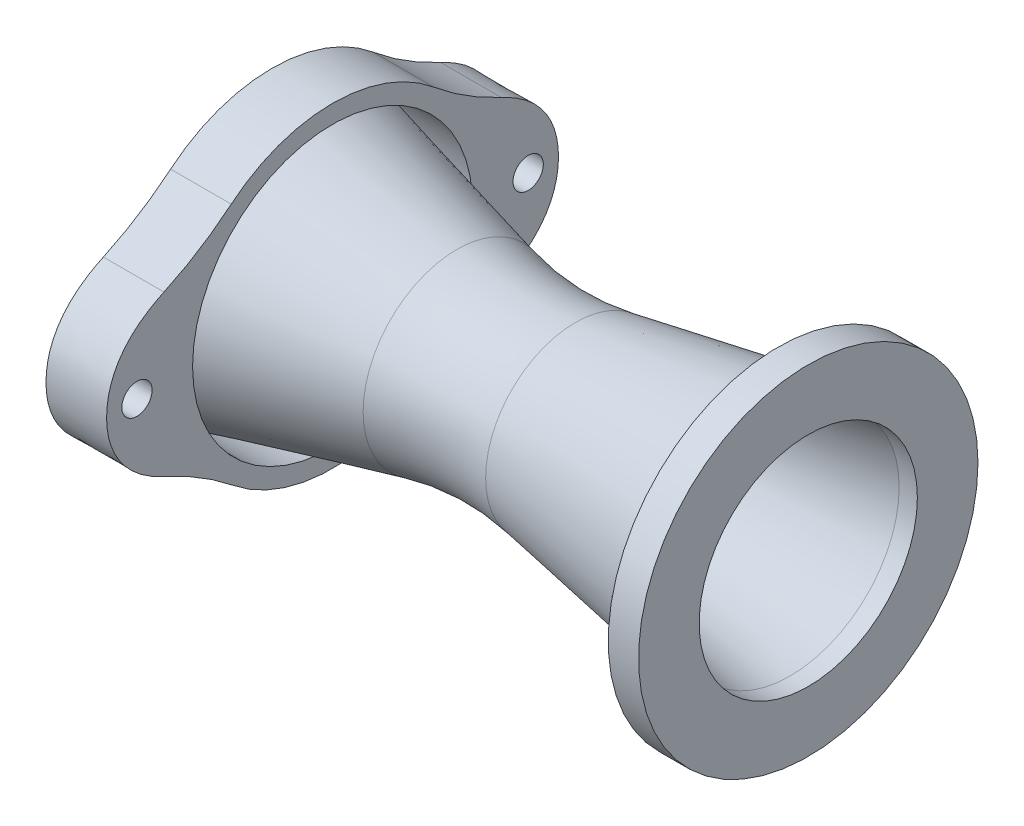
ISO-10303-21;
HEADER;
FILE_DESCRIPTION(('STEP AP214'),'2;1');
FILE_NAME('part.step','',(''),(''),'','','');
FILE_SCHEMA(('AUTOMOTIVE_DESIGN { 1 0 10303 214 1 1 1 1 }'));
ENDSEC;
DATA;
#1=APPLICATION_CONTEXT('core data for automotive mechanical design processes');
#2=APPLICATION_PROTOCOL_DEFINITION('international standard','automotive_design',2000,#1);
#3=PRODUCT_CONTEXT('',#1,'mechanical');
#4=PRODUCT('Part','Part','',(#3));
#5=PRODUCT_RELATED_PRODUCT_CATEGORY('part','',(#4));
#6=PRODUCT_DEFINITION_FORMATION('','',#4);
#7=PRODUCT_DEFINITION_CONTEXT('part definition',#1,'design');
#8=PRODUCT_DEFINITION('design','',#6,#7);
#9=PRODUCT_DEFINITION_SHAPE('','',#8);
#10=(LENGTH_UNIT() NAMED_UNIT(*) SI_UNIT(.MILLI.,.METRE.));
#11=(NAMED_UNIT(*) PLANE_ANGLE_UNIT() SI_UNIT($,.RADIAN.));
#12=(NAMED_UNIT(*) SI_UNIT($,.STERADIAN.) SOLID_ANGLE_UNIT());
#13=UNCERTAINTY_MEASURE_WITH_UNIT(LENGTH_MEASURE(1.E-05),#10,'distance_accuracy_value','');
#14=(GEOMETRIC_REPRESENTATION_CONTEXT(3) GLOBAL_UNCERTAINTY_ASSIGNED_CONTEXT((#13)) GLOBAL_UNIT_ASSIGNED_CONTEXT((#10,
#11,#12)) REPRESENTATION_CONTEXT('',''));
#15=CARTESIAN_POINT('',(0.,0.,0.));
#16=DIRECTION('',(0.,0.,1.));
#17=DIRECTION('',(1.,0.,0.));
#18=AXIS2_PLACEMENT_3D('',#15,#16,#17);
#19=CARTESIAN_POINT('',(-30.1078093353596,-13.5539780520738,27.4034156877221));
#20=CARTESIAN_POINT('',(-30.1078093353596,-10.2750713447395,34.7426730956908));
#21=CARTESIAN_POINT('',(-30.1078093353596,-0.192131780953562,39.8148012350881));
#22=CARTESIAN_POINT('',(-30.1078093353596,9.84624853569525,34.7120143001574));
#23=CARTESIAN_POINT('',(-30.1078093353596,13.0273974497542,27.8083695647826));
#24=B_SPLINE_CURVE_WITH_KNOTS('',3,(#19,#20,#21,#22,#23),.UNSPECIFIED.,.F.,.F.,(4,1,4),
(0.087296514858274,0.506662617116211,0.909417719061392),.UNSPECIFIED.);
#25=DIRECTION('',(-1.,0.,0.));
#26=VECTOR('',#25,1.);
#27=SURFACE_OF_LINEAR_EXTRUSION('',#24,#26);
#28=CARTESIAN_POINT('',(-40.1078093353596,-13.5539780520738,27.4034156877221));
#29=CARTESIAN_POINT('',(-40.1078093353596,-10.2750713447395,34.7426730956908));
#30=CARTESIAN_POINT('',(-40.1078093353596,-0.192131780953562,39.8148012350881));
#31=CARTESIAN_POINT('',(-40.1078093353596,9.84624853569525,34.7120143001574));
#32=CARTESIAN_POINT('',(-40.1078093353596,13.0273974497542,27.8083695647826));
#33=B_SPLINE_CURVE_WITH_KNOTS('',3,(#28,#29,#30,#31,#32),.UNSPECIFIED.,.F.,.F.,(4,1,4),
(0.087296514858274,0.506662617116211,0.909417719061392),.UNSPECIFIED.);
#34=CARTESIAN_POINT('',(-40.1078093353596,-13.5539780520738,27.4034156877221));
#35=VERTEX_POINT('',#34);
#36=CARTESIAN_POINT('',(-40.1078093353596,13.0273974497542,27.8083695647826));
#37=VERTEX_POINT('',#36);
#38=EDGE_CURVE('E144',#35,#37,#33,.T.);
#39=ORIENTED_EDGE('',*,*,#38,.F.);
#40=DIRECTION('',(-1.,0.,0.));
#41=VECTOR('',#40,1.);
#42=CARTESIAN_POINT('',(-30.1078093353596,-13.5539780520738,27.4034156877221));
#43=LINE('',#42,#41);
#44=CARTESIAN_POINT('',(-30.1078093353596,-13.5539780520738,27.4034156877221));
#45=VERTEX_POINT('',#44);
#46=EDGE_CURVE('E12',#45,#35,#43,.T.);
#47=ORIENTED_EDGE('',*,*,#46,.F.);
#48=CARTESIAN_POINT('',(-30.1078093353596,13.0273974497542,27.8083695647826));
#49=VERTEX_POINT('',#48);
#50=EDGE_CURVE('E175',#45,#49,#24,.T.);
#51=ORIENTED_EDGE('',*,*,#50,.T.);
#52=DIRECTION('',(-1.,0.,0.));
#53=VECTOR('',#52,1.);
#54=CARTESIAN_POINT('',(-30.1078093353596,13.0273974497542,27.8083695647826));
#55=LINE('',#54,#53);
#56=EDGE_CURVE('E47',#49,#37,#55,.T.);
#57=ORIENTED_EDGE('',*,*,#56,.T.);
#58=EDGE_LOOP('',(#39,#47,#51,#57));
#59=FACE_BOUND('',#58,.T.);
#60=ADVANCED_FACE('F43',(#59),#27,.T.);
#61=CARTESIAN_POINT('',(-30.1078093353596,-59.2051918811772,47.7986768022428));
#62=DIRECTION('',(-1.,0.,0.));
#63=DIRECTION('',(0.,0.,1.));
#64=AXIS2_PLACEMENT_3D('',#61,#62,#63);
#65=CYLINDRICAL_SURFACE('',#64,50.);
#66=CARTESIAN_POINT('',(-40.1078093353596,-59.2051918811772,47.7986768022428));
#67=DIRECTION('',(1.,0.,0.));
#68=DIRECTION('',(0.,0.,1.));
#69=AXIS2_PLACEMENT_3D('',#66,#67,#68);
#70=CIRCLE('',#69,50.);
#71=CARTESIAN_POINT('',(-40.1078093353596,-20.3014203399662,16.3901340173687));
#72=VERTEX_POINT('',#71);
#73=EDGE_CURVE('E173',#72,#35,#70,.T.);
#74=ORIENTED_EDGE('',*,*,#73,.F.);
#75=DIRECTION('',(-1.,0.,0.));
#76=VECTOR('',#75,1.);
#77=CARTESIAN_POINT('',(-30.1078093353596,-20.3014203399662,16.3901340173687));
#78=LINE('',#77,#76);
#79=CARTESIAN_POINT('',(-30.1078093353596,-20.3014203399662,16.3901340173687));
#80=VERTEX_POINT('',#79);
#81=EDGE_CURVE('E53',#80,#72,#78,.T.);
#82=ORIENTED_EDGE('',*,*,#81,.F.);
#83=CARTESIAN_POINT('',(-30.1078093353596,-59.2051918811772,47.7986768022428));
#84=DIRECTION('',(1.,0.,0.));
#85=DIRECTION('',(0.,0.,1.));
#86=AXIS2_PLACEMENT_3D('',#83,#84,#85);
#87=CIRCLE('',#86,50.);
#88=EDGE_CURVE('E131',#80,#45,#87,.T.);
#89=ORIENTED_EDGE('',*,*,#88,.T.);
#90=ORIENTED_EDGE('',*,*,#46,.T.);
#91=EDGE_LOOP('',(#74,#82,#89,#90));
#92=FACE_BOUND('',#91,.T.);
#93=ADVANCED_FACE('F187',(#92),#65,.F.);
#94=CARTESIAN_POINT('',(-30.1078093353596,0.,0.));
#95=DIRECTION('',(-1.,0.,0.));
#96=DIRECTION('',(0.,0.,1.));
#97=AXIS2_PLACEMENT_3D('',#94,#95,#96);
#98=CYLINDRICAL_SURFACE('',#97,26.0918408880497);
#99=CARTESIAN_POINT('',(-40.1078093353596,0.,0.));
#100=DIRECTION('',(-1.,0.,0.));
#101=DIRECTION('',(0.,0.,1.));
#102=AXIS2_PLACEMENT_3D('',#99,#100,#101);
#103=CIRCLE('',#102,26.0918408880497);
#104=CARTESIAN_POINT('',(-40.1078093353596,-20.3014203399662,-16.3901340173687));
#105=VERTEX_POINT('',#104);
#106=EDGE_CURVE('E118',#105,#72,#103,.T.);
#107=ORIENTED_EDGE('',*,*,#106,.F.);
#108=DIRECTION('',(-1.,0.,0.));
#109=VECTOR('',#108,1.);
#110=CARTESIAN_POINT('',(-30.1078093353596,-20.3014203399662,-16.3901340173687));
#111=LINE('',#110,#109);
#112=CARTESIAN_POINT('',(-30.1078093353596,-20.3014203399662,-16.3901340173687));
#113=VERTEX_POINT('',#112);
#114=EDGE_CURVE('E113',#113,#105,#111,.T.);
#115=ORIENTED_EDGE('',*,*,#114,.F.);
#116=CARTESIAN_POINT('',(-30.1078093353596,0.,0.));
#117=DIRECTION('',(-1.,0.,0.));
#118=DIRECTION('',(0.,0.,1.));
#119=AXIS2_PLACEMENT_3D('',#116,#117,#118);
#120=CIRCLE('',#119,26.0918408880497);
#121=EDGE_CURVE('E116',#113,#80,#120,.T.);
#122=ORIENTED_EDGE('',*,*,#121,.T.);
#123=ORIENTED_EDGE('',*,*,#81,.T.);
#124=EDGE_LOOP('',(#107,#115,#122,#123));
#125=FACE_BOUND('',#124,.T.);
#126=ADVANCED_FACE('F115',(#125),#98,.T.);
#127=CARTESIAN_POINT('',(-30.1078093353596,-59.2051918811772,-47.7986768022428));
#128=DIRECTION('',(-1.,0.,0.));
#129=DIRECTION('',(0.,0.,1.));
#130=AXIS2_PLACEMENT_3D('',#127,#128,#129);
#131=CYLINDRICAL_SURFACE('',#130,50.);
#132=CARTESIAN_POINT('',(-40.1078093353596,-59.2051918811772,-47.7986768022428));
#133=DIRECTION('',(1.,0.,0.));
#134=DIRECTION('',(0.,0.,-1.));
#135=AXIS2_PLACEMENT_3D('',#132,#133,#134);
#136=CIRCLE('',#135,50.);
#137=CARTESIAN_POINT('',(-40.1078093353596,-13.5539780520738,-27.4034156877221));
#138=VERTEX_POINT('',#137);
#139=EDGE_CURVE('E167',#138,#105,#136,.T.);
#140=ORIENTED_EDGE('',*,*,#139,.F.);
#141=DIRECTION('',(-1.,0.,0.));
#142=VECTOR('',#141,1.);
#143=CARTESIAN_POINT('',(-30.1078093353596,-13.5539780520738,-27.4034156877221));
#144=LINE('',#143,#142);
#145=CARTESIAN_POINT('',(-30.1078093353596,-13.5539780520738,-27.4034156877221));
#146=VERTEX_POINT('',#145);
#147=EDGE_CURVE('E123',#146,#138,#144,.T.);
#148=ORIENTED_EDGE('',*,*,#147,.F.);
#149=CARTESIAN_POINT('',(-30.1078093353596,-59.2051918811772,-47.7986768022428));
#150=DIRECTION('',(1.,0.,0.));
#151=DIRECTION('',(0.,0.,-1.));
#152=AXIS2_PLACEMENT_3D('',#149,#150,#151);
#153=CIRCLE('',#152,50.);
#154=EDGE_CURVE('E129',#146,#113,#153,.T.);
#155=ORIENTED_EDGE('',*,*,#154,.T.);
#156=ORIENTED_EDGE('',*,*,#114,.T.);
#157=EDGE_LOOP('',(#140,#148,#155,#156));
#158=FACE_BOUND('',#157,.T.);
#159=ADVANCED_FACE('F133',(#158),#131,.F.);
#160=CARTESIAN_POINT('',(-30.1078093353596,13.0273974497542,-27.8083695647827));
#161=CARTESIAN_POINT('',(-30.1078093353596,9.8462485356952,-34.7120143001575));
#162=CARTESIAN_POINT('',(-30.1078093353596,-0.192131780953567,-39.8148012350881));
#163=CARTESIAN_POINT('',(-30.1078093353596,-10.2750713447395,-34.7426730956908));
#164=CARTESIAN_POINT('',(-30.1078093353596,-13.5539780520738,-27.4034156877221));
#165=B_SPLINE_CURVE_WITH_KNOTS('',3,(#160,#161,#162,#163,#164),.UNSPECIFIED.,.F.,.F.,(4,1,4),
(0.087296514858274,0.490051616803455,0.909417719061391),.UNSPECIFIED.);
#166=DIRECTION('',(-1.,0.,0.));
#167=VECTOR('',#166,1.);
#168=SURFACE_OF_LINEAR_EXTRUSION('',#165,#167);
#169=CARTESIAN_POINT('',(-40.1078093353596,13.0273974497542,-27.8083695647827));
#170=CARTESIAN_POINT('',(-40.1078093353596,9.8462485356952,-34.7120143001575));
#171=CARTESIAN_POINT('',(-40.1078093353596,-0.192131780953567,-39.8148012350881));
#172=CARTESIAN_POINT('',(-40.1078093353596,-10.2750713447395,-34.7426730956908));
#173=CARTESIAN_POINT('',(-40.1078093353596,-13.5539780520738,-27.4034156877221));
#174=B_SPLINE_CURVE_WITH_KNOTS('',3,(#169,#170,#171,#172,#173),.UNSPECIFIED.,.F.,.F.,(4,1,4),
(0.087296514858274,0.490051616803455,0.909417719061391),.UNSPECIFIED.);
#175=CARTESIAN_POINT('',(-40.1078093353596,13.0273974497542,-27.8083695647827));
#176=VERTEX_POINT('',#175);
#177=EDGE_CURVE('E162',#176,#138,#174,.T.);
#178=ORIENTED_EDGE('',*,*,#177,.F.);
#179=DIRECTION('',(-1.,0.,0.));
#180=VECTOR('',#179,1.);
#181=CARTESIAN_POINT('',(-30.1078093353596,13.0273974497542,-27.8083695647827));
#182=LINE('',#181,#180);
#183=CARTESIAN_POINT('',(-30.1078093353596,13.0273974497542,-27.8083695647827));
#184=VERTEX_POINT('',#183);
#185=EDGE_CURVE('E179',#184,#176,#182,.T.);
#186=ORIENTED_EDGE('',*,*,#185,.F.);
#187=EDGE_CURVE('E134',#184,#146,#165,.T.);
#188=ORIENTED_EDGE('',*,*,#187,.T.);
#189=ORIENTED_EDGE('',*,*,#147,.T.);
#190=EDGE_LOOP('',(#178,#186,#188,#189));
#191=FACE_BOUND('',#190,.T.);
#192=ADVANCED_FACE('F200',(#191),#168,.T.);
#193=CARTESIAN_POINT('',(-30.1078093353596,58.4382440202938,-48.733354958969));
#194=DIRECTION('',(-1.,0.,0.));
#195=DIRECTION('',(0.,0.,1.));
#196=AXIS2_PLACEMENT_3D('',#193,#194,#195);
#197=CYLINDRICAL_SURFACE('',#196,50.);
#198=CARTESIAN_POINT('',(-40.1078093353596,58.4382440202938,-48.733354958969));
#199=DIRECTION('',(1.,0.,0.));
#200=DIRECTION('',(0.,0.,1.));
#201=AXIS2_PLACEMENT_3D('',#198,#199,#200);
#202=CIRCLE('',#201,50.);
#203=CARTESIAN_POINT('',(-40.1078093353596,20.0384344360631,-16.7106345265194));
#204=VERTEX_POINT('',#203);
#205=EDGE_CURVE('E159',#204,#176,#202,.T.);
#206=ORIENTED_EDGE('',*,*,#205,.F.);
#207=DIRECTION('',(-1.,0.,0.));
#208=VECTOR('',#207,1.);
#209=CARTESIAN_POINT('',(-30.1078093353596,20.0384344360631,-16.7106345265194));
#210=LINE('',#209,#208);
#211=CARTESIAN_POINT('',(-30.1078093353596,20.0384344360631,-16.7106345265194));
#212=VERTEX_POINT('',#211);
#213=EDGE_CURVE('E181',#212,#204,#210,.T.);
#214=ORIENTED_EDGE('',*,*,#213,.F.);
#215=CARTESIAN_POINT('',(-30.1078093353596,58.4382440202938,-48.733354958969));
#216=DIRECTION('',(1.,0.,0.));
#217=DIRECTION('',(0.,0.,1.));
#218=AXIS2_PLACEMENT_3D('',#215,#216,#217);
#219=CIRCLE('',#218,50.);
#220=EDGE_CURVE('E136',#212,#184,#219,.T.);
#221=ORIENTED_EDGE('',*,*,#220,.T.);
#222=ORIENTED_EDGE('',*,*,#185,.T.);
#223=EDGE_LOOP('',(#206,#214,#221,#222));
#224=FACE_BOUND('',#223,.T.);
#225=ADVANCED_FACE('F203',(#224),#197,.F.);
#226=CARTESIAN_POINT('',(-30.1078093353596,0.,0.));
#227=DIRECTION('',(-1.,0.,0.));
#228=DIRECTION('',(0.,0.,1.));
#229=AXIS2_PLACEMENT_3D('',#226,#227,#228);
#230=CYLINDRICAL_SURFACE('',#229,26.0918408880497);
#231=CARTESIAN_POINT('',(-40.1078093353596,0.,0.));
#232=DIRECTION('',(-1.,0.,0.));
#233=DIRECTION('',(0.,0.,1.));
#234=AXIS2_PLACEMENT_3D('',#231,#232,#233);
#235=CIRCLE('',#234,26.0918408880497);
#236=CARTESIAN_POINT('',(-40.1078093353596,20.0384344360631,16.7106345265194));
#237=VERTEX_POINT('',#236);
#238=EDGE_CURVE('E156',#237,#204,#235,.T.);
#239=ORIENTED_EDGE('',*,*,#238,.F.);
#240=DIRECTION('',(-1.,0.,0.));
#241=VECTOR('',#240,1.);
#242=CARTESIAN_POINT('',(-30.1078093353596,20.0384344360631,16.7106345265194));
#243=LINE('',#242,#241);
#244=CARTESIAN_POINT('',(-30.1078093353596,20.0384344360631,16.7106345265194));
#245=VERTEX_POINT('',#244);
#246=EDGE_CURVE('E182',#245,#237,#243,.T.);
#247=ORIENTED_EDGE('',*,*,#246,.F.);
#248=CARTESIAN_POINT('',(-30.1078093353596,0.,0.));
#249=DIRECTION('',(-1.,0.,0.));
#250=DIRECTION('',(0.,0.,1.));
#251=AXIS2_PLACEMENT_3D('',#248,#249,#250);
#252=CIRCLE('',#251,26.0918408880497);
#253=EDGE_CURVE('E264',#245,#212,#252,.T.);
#254=ORIENTED_EDGE('',*,*,#253,.T.);
#255=ORIENTED_EDGE('',*,*,#213,.T.);
#256=EDGE_LOOP('',(#239,#247,#254,#255));
#257=FACE_BOUND('',#256,.T.);
#258=ADVANCED_FACE('F207',(#257),#230,.T.);
#259=CARTESIAN_POINT('',(-30.1078093353596,58.4382440202938,48.733354958969));
#260=DIRECTION('',(-1.,0.,0.));
#261=DIRECTION('',(0.,0.,1.));
#262=AXIS2_PLACEMENT_3D('',#259,#260,#261);
#263=CYLINDRICAL_SURFACE('',#262,50.);
#264=CARTESIAN_POINT('',(-40.1078093353596,58.4382440202938,48.733354958969));
#265=DIRECTION('',(1.,0.,0.));
#266=DIRECTION('',(0.,0.,-1.));
#267=AXIS2_PLACEMENT_3D('',#264,#265,#266);
#268=CIRCLE('',#267,50.);
#269=EDGE_CURVE('E149',#37,#237,#268,.T.);
#270=ORIENTED_EDGE('',*,*,#269,.F.);
#271=ORIENTED_EDGE('',*,*,#56,.F.);
#272=CARTESIAN_POINT('',(-30.1078093353596,58.4382440202938,48.733354958969));
#273=DIRECTION('',(1.,0.,0.));
#274=DIRECTION('',(0.,0.,-1.));
#275=AXIS2_PLACEMENT_3D('',#272,#273,#274);
#276=CIRCLE('',#275,50.);
#277=EDGE_CURVE('E259',#49,#245,#276,.T.);
#278=ORIENTED_EDGE('',*,*,#277,.T.);
#279=ORIENTED_EDGE('',*,*,#246,.T.);
#280=EDGE_LOOP('',(#270,#271,#278,#279));
#281=FACE_BOUND('',#280,.T.);
#282=ADVANCED_FACE('F184',(#281),#263,.F.);
#283=CARTESIAN_POINT('',(-30.1078093353596,-0.304899637545887,37.2701725227464));
#284=DIRECTION('',(1.,0.,0.));
#285=DIRECTION('',(0.,0.,-1.));
#286=AXIS2_PLACEMENT_3D('',#283,#284,#285);
#287=PLANE('',#286);
#288=CARTESIAN_POINT('',(-30.1078093353596,0.,32.269724273095));
#289=DIRECTION('',(-1.,0.,0.));
#290=DIRECTION('',(0.,0.,1.));
#291=AXIS2_PLACEMENT_3D('',#288,#289,#290);
#292=CIRCLE('',#291,2.5);
#293=CARTESIAN_POINT('',(-30.1078093353596,0.,34.769724273095));
#294=VERTEX_POINT('',#293);
#295=EDGE_CURVE('E238',#294,#294,#292,.T.);
#296=ORIENTED_EDGE('',*,*,#295,.T.);
#297=EDGE_LOOP('',(#296));
#298=FACE_BOUND('',#297,.T.);
#299=CARTESIAN_POINT('',(-30.1078093353596,0.,-32.269724273095));
#300=DIRECTION('',(-1.,0.,0.));
#301=DIRECTION('',(0.,0.,1.));
#302=AXIS2_PLACEMENT_3D('',#299,#300,#301);
#303=CIRCLE('',#302,2.5);
#304=CARTESIAN_POINT('',(-30.1078093353596,0.,-29.769724273095));
#305=VERTEX_POINT('',#304);
#306=EDGE_CURVE('E246',#305,#305,#303,.T.);
#307=ORIENTED_EDGE('',*,*,#306,.T.);
#308=EDGE_LOOP('',(#307));
#309=FACE_BOUND('',#308,.T.);
#310=CARTESIAN_POINT('',(-30.1078093353596,0.,0.));
#311=DIRECTION('',(-1.,0.,0.));
#312=DIRECTION('',(0.,0.,1.));
#313=AXIS2_PLACEMENT_3D('',#310,#311,#312);
#314=CIRCLE('',#313,23.0918408880497);
#315=CARTESIAN_POINT('',(-30.1078093353596,0.,23.0918408880497));
#316=VERTEX_POINT('',#315);
#317=EDGE_CURVE('E150',#316,#316,#314,.T.);
#318=ORIENTED_EDGE('',*,*,#317,.T.);
#319=EDGE_LOOP('',(#318));
#320=FACE_BOUND('',#319,.T.);
#321=ORIENTED_EDGE('',*,*,#50,.F.);
#322=ORIENTED_EDGE('',*,*,#88,.F.);
#323=ORIENTED_EDGE('',*,*,#121,.F.);
#324=ORIENTED_EDGE('',*,*,#154,.F.);
#325=ORIENTED_EDGE('',*,*,#187,.F.);
#326=ORIENTED_EDGE('',*,*,#220,.F.);
#327=ORIENTED_EDGE('',*,*,#253,.F.);
#328=ORIENTED_EDGE('',*,*,#277,.F.);
#329=EDGE_LOOP('',(#321,#322,#323,#324,#325,#326,#327,#328));
#330=FACE_BOUND('',#329,.T.);
#331=ADVANCED_FACE('F127',(#298,#309,#320,#330),#287,.T.);
#332=CARTESIAN_POINT('',(-40.1078093353596,-0.304899637545887,37.2701725227464));
#333=DIRECTION('',(1.,0.,0.));
#334=DIRECTION('',(0.,0.,-1.));
#335=AXIS2_PLACEMENT_3D('',#332,#333,#334);
#336=PLANE('',#335);
#337=CARTESIAN_POINT('',(-40.1078093353596,0.,32.269724273095));
#338=DIRECTION('',(-1.,0.,0.));
#339=DIRECTION('',(0.,0.,1.));
#340=AXIS2_PLACEMENT_3D('',#337,#338,#339);
#341=CIRCLE('',#340,2.5);
#342=CARTESIAN_POINT('',(-40.1078093353596,0.,34.769724273095));
#343=VERTEX_POINT('',#342);
#344=EDGE_CURVE('E241',#343,#343,#341,.T.);
#345=ORIENTED_EDGE('',*,*,#344,.F.);
#346=EDGE_LOOP('',(#345));
#347=FACE_BOUND('',#346,.T.);
#348=CARTESIAN_POINT('',(-40.1078093353596,0.,-32.269724273095));
#349=DIRECTION('',(-1.,0.,0.));
#350=DIRECTION('',(0.,0.,1.));
#351=AXIS2_PLACEMENT_3D('',#348,#349,#350);
#352=CIRCLE('',#351,2.5);
#353=CARTESIAN_POINT('',(-40.1078093353596,0.,-29.769724273095));
#354=VERTEX_POINT('',#353);
#355=EDGE_CURVE('E243',#354,#354,#352,.T.);
#356=ORIENTED_EDGE('',*,*,#355,.F.);
#357=EDGE_LOOP('',(#356));
#358=FACE_BOUND('',#357,.T.);
#359=CARTESIAN_POINT('',(-40.1078093353596,0.,0.));
#360=DIRECTION('',(-1.,0.,0.));
#361=DIRECTION('',(0.,0.,1.));
#362=AXIS2_PLACEMENT_3D('',#359,#360,#361);
#363=CIRCLE('',#362,23.0918408880497);
#364=CARTESIAN_POINT('',(-40.1078093353596,0.,23.0918408880497));
#365=VERTEX_POINT('',#364);
#366=EDGE_CURVE('E249',#365,#365,#363,.T.);
#367=ORIENTED_EDGE('',*,*,#366,.F.);
#368=EDGE_LOOP('',(#367));
#369=FACE_BOUND('',#368,.T.);
#370=ORIENTED_EDGE('',*,*,#38,.T.);
#371=ORIENTED_EDGE('',*,*,#269,.T.);
#372=ORIENTED_EDGE('',*,*,#238,.T.);
#373=ORIENTED_EDGE('',*,*,#205,.T.);
#374=ORIENTED_EDGE('',*,*,#177,.T.);
#375=ORIENTED_EDGE('',*,*,#139,.T.);
#376=ORIENTED_EDGE('',*,*,#106,.T.);
#377=ORIENTED_EDGE('',*,*,#73,.T.);
#378=EDGE_LOOP('',(#370,#371,#372,#373,#374,#375,#376,#377));
#379=FACE_BOUND('',#378,.T.);
#380=ADVANCED_FACE('F186',(#347,#358,#369,#379),#336,.F.);
#381=CARTESIAN_POINT('',(-30.1078093353596,0.,0.));
#382=DIRECTION('',(-1.,0.,0.));
#383=DIRECTION('',(0.,0.,1.));
#384=AXIS2_PLACEMENT_3D('',#381,#382,#383);
#385=CYLINDRICAL_SURFACE('',#384,23.0918408880497);
#386=ORIENTED_EDGE('',*,*,#317,.F.);
#387=EDGE_LOOP('',(#386));
#388=FACE_BOUND('',#387,.T.);
#389=ORIENTED_EDGE('',*,*,#366,.T.);
#390=EDGE_LOOP('',(#389));
#391=FACE_BOUND('',#390,.T.);
#392=ADVANCED_FACE('F219',(#388,#391),#385,.F.);
#393=CARTESIAN_POINT('',(-30.1078093353596,0.,-32.269724273095));
#394=DIRECTION('',(-1.,0.,0.));
#395=DIRECTION('',(0.,0.,1.));
#396=AXIS2_PLACEMENT_3D('',#393,#394,#395);
#397=CYLINDRICAL_SURFACE('',#396,2.5);
#398=ORIENTED_EDGE('',*,*,#306,.F.);
#399=EDGE_LOOP('',(#398));
#400=FACE_BOUND('',#399,.T.);
#401=ORIENTED_EDGE('',*,*,#355,.T.);
#402=EDGE_LOOP('',(#401));
#403=FACE_BOUND('',#402,.T.);
#404=ADVANCED_FACE('F226',(#400,#403),#397,.F.);
#405=CARTESIAN_POINT('',(-30.1078093353596,0.,32.269724273095));
#406=DIRECTION('',(-1.,0.,0.));
#407=DIRECTION('',(0.,0.,1.));
#408=AXIS2_PLACEMENT_3D('',#405,#406,#407);
#409=CYLINDRICAL_SURFACE('',#408,2.5);
#410=ORIENTED_EDGE('',*,*,#295,.F.);
#411=EDGE_LOOP('',(#410));
#412=FACE_BOUND('',#411,.T.);
#413=ORIENTED_EDGE('',*,*,#344,.T.);
#414=EDGE_LOOP('',(#413));
#415=FACE_BOUND('',#414,.T.);
#416=ADVANCED_FACE('F230',(#412,#415),#409,.F.);
#417=CLOSED_SHELL('',(#60,#93,#126,#159,#192,#225,#258,#282,#331,#380,#392,#404,#416));
#418=MANIFOLD_SOLID_BREP('B2_NOT_SHOWN',#417);
#419=CARTESIAN_POINT('',(44.8493100239427,0.,0.));
#420=DIRECTION('',(1.,0.,0.));
#421=DIRECTION('',(0.,0.,-1.));
#422=AXIS2_PLACEMENT_3D('',#419,#420,#421);
#423=CONICAL_SURFACE('',#422,20.9544232590366,0.174532925199426);
#424=CARTESIAN_POINT('',(9.9454229613117,0.,0.));
#425=DIRECTION('',(-1.,0.,0.));
#426=DIRECTION('',(0.,0.,1.));
#427=AXIS2_PLACEMENT_3D('',#424,#425,#426);
#428=CIRCLE('',#427,14.7999262382939);
#429=CARTESIAN_POINT('',(9.9454229613117,0.,14.7999262382939));
#430=VERTEX_POINT('',#429);
#431=EDGE_CURVE('E370',#430,#430,#428,.T.);
#432=ORIENTED_EDGE('',*,*,#431,.F.);
#433=EDGE_LOOP('',(#432));
#434=FACE_BOUND('',#433,.T.);
#435=CARTESIAN_POINT('',(43.3702545569434,0.,0.));
#436=DIRECTION('',(1.,0.,0.));
#437=DIRECTION('',(0.,0.,-1.));
#438=AXIS2_PLACEMENT_3D('',#435,#436,#437);
#439=CIRCLE('',#438,20.6936258742403);
#440=CARTESIAN_POINT('',(43.3702545569434,0.,-20.6936258742403));
#441=VERTEX_POINT('',#440);
#442=EDGE_CURVE('E42',#441,#441,#439,.T.);
#443=ORIENTED_EDGE('',*,*,#442,.F.);
#444=EDGE_LOOP('',(#443));
#445=FACE_BOUND('',#444,.T.);
#446=ADVANCED_FACE('F356',(#434,#445),#423,.T.);
#447=CARTESIAN_POINT('',(-40.1078093353596,20.,0.));
#448=DIRECTION('',(1.,0.,0.));
#449=DIRECTION('',(0.,0.,-1.));
#450=AXIS2_PLACEMENT_3D('',#447,#448,#449);
#451=PLANE('',#450);
#452=CARTESIAN_POINT('',(-40.1078093353596,0.,0.));
#453=DIRECTION('',(-1.,0.,0.));
#454=DIRECTION('',(0.,0.,1.));
#455=AXIS2_PLACEMENT_3D('',#452,#453,#454);
#456=CIRCLE('',#455,20.);
#457=CARTESIAN_POINT('',(-40.1078093353596,0.,20.));
#458=VERTEX_POINT('',#457);
#459=EDGE_CURVE('E374',#458,#458,#456,.T.);
#460=ORIENTED_EDGE('',*,*,#459,.F.);
#461=EDGE_LOOP('',(#460));
#462=FACE_BOUND('',#461,.T.);
#463=CARTESIAN_POINT('',(-40.1078093353596,0.,0.));
#464=DIRECTION('',(1.,0.,0.));
#465=DIRECTION('',(0.,0.,-1.));
#466=AXIS2_PLACEMENT_3D('',#463,#464,#465);
#467=CIRCLE('',#466,23.0918408880497);
#468=CARTESIAN_POINT('',(-40.1078093353596,0.,-23.0918408880497));
#469=VERTEX_POINT('',#468);
#470=EDGE_CURVE('E362',#469,#469,#467,.F.);
#471=ORIENTED_EDGE('',*,*,#470,.T.);
#472=EDGE_LOOP('',(#471));
#473=FACE_BOUND('',#472,.T.);
#474=ADVANCED_FACE('F410',(#462,#473),#451,.F.);
#475=CARTESIAN_POINT('',(-9.58637048221776,0.,0.));
#476=DIRECTION('',(-1.,0.,0.));
#477=DIRECTION('',(0.,0.,1.));
#478=AXIS2_PLACEMENT_3D('',#475,#476,#477);
#479=CONICAL_SURFACE('',#478,15.4819914948958,0.244346095279199);
#480=ORIENTED_EDGE('',*,*,#470,.F.);
#481=EDGE_LOOP('',(#480));
#482=FACE_BOUND('',#481,.T.);
#483=CARTESIAN_POINT('',(-9.58637048221776,0.,0.));
#484=DIRECTION('',(-1.,0.,0.));
#485=DIRECTION('',(0.,0.,1.));
#486=AXIS2_PLACEMENT_3D('',#483,#484,#485);
#487=CIRCLE('',#486,15.4819914948958);
#488=CARTESIAN_POINT('',(-9.58637048221776,0.,15.4819914948958));
#489=VERTEX_POINT('',#488);
#490=EDGE_CURVE('E366',#489,#489,#487,.T.);
#491=ORIENTED_EDGE('',*,*,#490,.T.);
#492=EDGE_LOOP('',(#491));
#493=FACE_BOUND('',#492,.T.);
#494=ADVANCED_FACE('F415',(#482,#493),#479,.T.);
#495=CARTESIAN_POINT('',(1.78395861096629,0.,0.));
#496=DIRECTION('',(-1.,0.,0.));
#497=DIRECTION('',(0.,0.,1.));
#498=AXIS2_PLACEMENT_3D('',#495,#496,#497);
#499=TOROIDAL_SURFACE('',#498,61.0858906298677,47.);
#500=ORIENTED_EDGE('',*,*,#490,.F.);
#501=EDGE_LOOP('',(#500));
#502=FACE_BOUND('',#501,.T.);
#503=ORIENTED_EDGE('',*,*,#431,.T.);
#504=EDGE_LOOP('',(#503));
#505=FACE_BOUND('',#504,.T.);
#506=ADVANCED_FACE('F421',(#502,#505),#499,.F.);
#507=CARTESIAN_POINT('',(-10.3121361690167,0.,0.));
#508=DIRECTION('',(-1.,0.,0.));
#509=DIRECTION('',(0.,0.,1.));
#510=AXIS2_PLACEMENT_3D('',#507,#508,#509);
#511=CONICAL_SURFACE('',#510,12.5711043160678,0.244346095279199);
#512=ORIENTED_EDGE('',*,*,#459,.T.);
#513=EDGE_LOOP('',(#512));
#514=FACE_BOUND('',#513,.T.);
#515=CARTESIAN_POINT('',(-10.3121361690167,0.,0.));
#516=DIRECTION('',(-1.,0.,0.));
#517=DIRECTION('',(0.,0.,1.));
#518=AXIS2_PLACEMENT_3D('',#515,#516,#517);
#519=CIRCLE('',#518,12.5711043160678);
#520=CARTESIAN_POINT('',(-10.3121361690167,0.,12.5711043160678));
#521=VERTEX_POINT('',#520);
#522=EDGE_CURVE('E378',#521,#521,#519,.T.);
#523=ORIENTED_EDGE('',*,*,#522,.F.);
#524=EDGE_LOOP('',(#523));
#525=FACE_BOUND('',#524,.T.);
#526=ADVANCED_FACE('F423',(#514,#525),#511,.F.);
#527=CARTESIAN_POINT('',(1.78395861096629,0.,0.));
#528=DIRECTION('',(-1.,0.,0.));
#529=DIRECTION('',(0.,0.,1.));
#530=AXIS2_PLACEMENT_3D('',#527,#528,#529);
#531=TOROIDAL_SURFACE('',#530,61.0858906298677,50.);
#532=ORIENTED_EDGE('',*,*,#522,.T.);
#533=EDGE_LOOP('',(#532));
#534=FACE_BOUND('',#533,.T.);
#535=CARTESIAN_POINT('',(10.4663674943125,0.,0.));
#536=DIRECTION('',(-1.,0.,0.));
#537=DIRECTION('',(0.,0.,1.));
#538=AXIS2_PLACEMENT_3D('',#535,#536,#537);
#539=CIRCLE('',#538,11.8455029792573);
#540=CARTESIAN_POINT('',(10.4663674943125,0.,11.8455029792573));
#541=VERTEX_POINT('',#540);
#542=EDGE_CURVE('E381',#541,#541,#539,.T.);
#543=ORIENTED_EDGE('',*,*,#542,.F.);
#544=EDGE_LOOP('',(#543));
#545=FACE_BOUND('',#544,.T.);
#546=ADVANCED_FACE('F429',(#534,#545),#531,.T.);
#547=CARTESIAN_POINT('',(45.3702545569435,0.,0.));
#548=DIRECTION('',(1.,0.,0.));
#549=DIRECTION('',(0.,0.,-1.));
#550=AXIS2_PLACEMENT_3D('',#547,#548,#549);
#551=CONICAL_SURFACE('',#550,18.,0.174532925199426);
#552=ORIENTED_EDGE('',*,*,#542,.T.);
#553=EDGE_LOOP('',(#552));
#554=FACE_BOUND('',#553,.T.);
#555=CARTESIAN_POINT('',(45.3702545569435,0.,0.));
#556=DIRECTION('',(-1.,0.,0.));
#557=DIRECTION('',(0.,0.,1.));
#558=AXIS2_PLACEMENT_3D('',#555,#556,#557);
#559=CIRCLE('',#558,18.);
#560=CARTESIAN_POINT('',(45.3702545569435,0.,18.));
#561=VERTEX_POINT('',#560);
#562=EDGE_CURVE('E384',#561,#561,#559,.T.);
#563=ORIENTED_EDGE('',*,*,#562,.F.);
#564=EDGE_LOOP('',(#563));
#565=FACE_BOUND('',#564,.T.);
#566=ADVANCED_FACE('F438',(#554,#565),#551,.F.);
#567=CARTESIAN_POINT('',(43.3702545569434,0.,0.));
#568=DIRECTION('',(1.,0.,0.));
#569=DIRECTION('',(0.,0.,-1.));
#570=AXIS2_PLACEMENT_3D('',#567,#568,#569);
#571=CYLINDRICAL_SURFACE('',#570,28.);
#572=CARTESIAN_POINT('',(43.3702545569434,0.,0.));
#573=DIRECTION('',(1.,0.,0.));
#574=DIRECTION('',(0.,0.,-1.));
#575=AXIS2_PLACEMENT_3D('',#572,#573,#574);
#576=CIRCLE('',#575,28.);
#577=CARTESIAN_POINT('',(43.3702545569434,0.,-28.));
#578=VERTEX_POINT('',#577);
#579=EDGE_CURVE('E387',#578,#578,#576,.T.);
#580=ORIENTED_EDGE('',*,*,#579,.T.);
#581=EDGE_LOOP('',(#580));
#582=FACE_BOUND('',#581,.T.);
#583=CARTESIAN_POINT('',(48.3702545569435,0.,0.));
#584=DIRECTION('',(1.,0.,0.));
#585=DIRECTION('',(0.,0.,-1.));
#586=AXIS2_PLACEMENT_3D('',#583,#584,#585);
#587=CIRCLE('',#586,28.);
#588=CARTESIAN_POINT('',(48.3702545569435,0.,-28.));
#589=VERTEX_POINT('',#588);
#590=EDGE_CURVE('E390',#589,#589,#587,.T.);
#591=ORIENTED_EDGE('',*,*,#590,.F.);
#592=EDGE_LOOP('',(#591));
#593=FACE_BOUND('',#592,.T.);
#594=ADVANCED_FACE('F442',(#582,#593),#571,.T.);
#595=CARTESIAN_POINT('',(43.3702545569434,0.,0.));
#596=DIRECTION('',(1.,0.,0.));
#597=DIRECTION('',(0.,0.,-1.));
#598=AXIS2_PLACEMENT_3D('',#595,#596,#597);
#599=PLANE('',#598);
#600=ORIENTED_EDGE('',*,*,#442,.T.);
#601=EDGE_LOOP('',(#600));
#602=FACE_BOUND('',#601,.T.);
#603=ORIENTED_EDGE('',*,*,#579,.F.);
#604=EDGE_LOOP('',(#603));
#605=FACE_BOUND('',#604,.T.);
#606=ADVANCED_FACE('F406',(#602,#605),#599,.F.);
#607=CARTESIAN_POINT('',(43.3702545569434,0.,0.));
#608=DIRECTION('',(1.,0.,0.));
#609=DIRECTION('',(0.,0.,-1.));
#610=AXIS2_PLACEMENT_3D('',#607,#608,#609);
#611=CYLINDRICAL_SURFACE('',#610,18.);
#612=ORIENTED_EDGE('',*,*,#562,.T.);
#613=EDGE_LOOP('',(#612));
#614=FACE_BOUND('',#613,.T.);
#615=CARTESIAN_POINT('',(48.3702545569435,0.,0.));
#616=DIRECTION('',(1.,0.,0.));
#617=DIRECTION('',(0.,0.,-1.));
#618=AXIS2_PLACEMENT_3D('',#615,#616,#617);
#619=CIRCLE('',#618,18.);
#620=CARTESIAN_POINT('',(48.3702545569435,0.,-18.));
#621=VERTEX_POINT('',#620);
#622=EDGE_CURVE('E393',#621,#621,#619,.T.);
#623=ORIENTED_EDGE('',*,*,#622,.T.);
#624=EDGE_LOOP('',(#623));
#625=FACE_BOUND('',#624,.T.);
#626=ADVANCED_FACE('F397',(#614,#625),#611,.F.);
#627=CARTESIAN_POINT('',(48.3702545569435,0.,0.));
#628=DIRECTION('',(1.,0.,0.));
#629=DIRECTION('',(0.,0.,-1.));
#630=AXIS2_PLACEMENT_3D('',#627,#628,#629);
#631=PLANE('',#630);
#632=ORIENTED_EDGE('',*,*,#590,.T.);
#633=EDGE_LOOP('',(#632));
#634=FACE_BOUND('',#633,.T.);
#635=ORIENTED_EDGE('',*,*,#622,.F.);
#636=EDGE_LOOP('',(#635));
#637=FACE_BOUND('',#636,.T.);
#638=ADVANCED_FACE('F399',(#634,#637),#631,.T.);
#639=CLOSED_SHELL('',(#446,#474,#494,#506,#526,#546,#566,#594,#606,#626,#638));
#640=MANIFOLD_SOLID_BREP('B6',#639);
#641=ADVANCED_BREP_SHAPE_REPRESENTATION('',(#18,#418,#640),#14);
#642=SHAPE_DEFINITION_REPRESENTATION(#9,#641);
ENDSEC;
END-ISO-10303-21;
